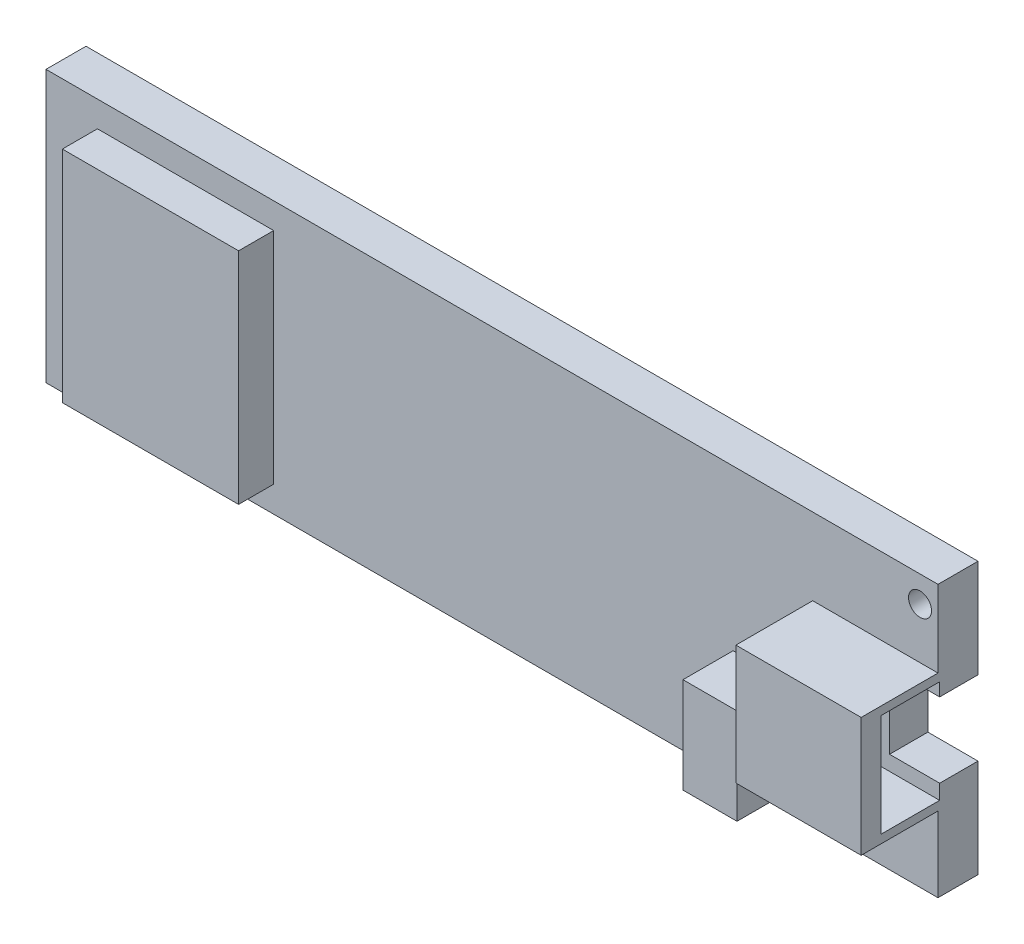
ISO-10303-21;
HEADER;
FILE_DESCRIPTION(('STEP AP214'),'2;1');
FILE_NAME('part.step','',(''),(''),'','','');
FILE_SCHEMA(('AUTOMOTIVE_DESIGN { 1 0 10303 214 1 1 1 1 }'));
ENDSEC;
DATA;
#1=APPLICATION_CONTEXT('core data for automotive mechanical design processes');
#2=APPLICATION_PROTOCOL_DEFINITION('international standard','automotive_design',2000,#1);
#3=PRODUCT_CONTEXT('',#1,'mechanical');
#4=PRODUCT('Part','Part','',(#3));
#5=PRODUCT_RELATED_PRODUCT_CATEGORY('part','',(#4));
#6=PRODUCT_DEFINITION_FORMATION('','',#4);
#7=PRODUCT_DEFINITION_CONTEXT('part definition',#1,'design');
#8=PRODUCT_DEFINITION('design','',#6,#7);
#9=PRODUCT_DEFINITION_SHAPE('','',#8);
#10=(LENGTH_UNIT() NAMED_UNIT(*) SI_UNIT(.MILLI.,.METRE.));
#11=(NAMED_UNIT(*) PLANE_ANGLE_UNIT() SI_UNIT($,.RADIAN.));
#12=(NAMED_UNIT(*) SI_UNIT($,.STERADIAN.) SOLID_ANGLE_UNIT());
#13=UNCERTAINTY_MEASURE_WITH_UNIT(LENGTH_MEASURE(1.E-05),#10,'distance_accuracy_value','');
#14=(GEOMETRIC_REPRESENTATION_CONTEXT(3) GLOBAL_UNCERTAINTY_ASSIGNED_CONTEXT((#13)) GLOBAL_UNIT_ASSIGNED_CONTEXT((#10,
#11,#12)) REPRESENTATION_CONTEXT('',''));
#15=CARTESIAN_POINT('',(0.,0.,0.));
#16=DIRECTION('',(0.,0.,1.));
#17=DIRECTION('',(1.,0.,0.));
#18=AXIS2_PLACEMENT_3D('',#15,#16,#17);
#19=CARTESIAN_POINT('',(-53.4,16.25,4.79));
#20=DIRECTION('',(0.,0.,1.));
#21=DIRECTION('',(1.,0.,0.));
#22=AXIS2_PLACEMENT_3D('',#19,#20,#21);
#23=PLANE('',#22);
#24=CARTESIAN_POINT('',(51.25,13.12,4.79));
#25=DIRECTION('',(0.,0.,1.));
#26=DIRECTION('',(1.,0.,0.));
#27=AXIS2_PLACEMENT_3D('',#24,#25,#26);
#28=CIRCLE('',#27,1.375);
#29=CARTESIAN_POINT('',(52.625,13.12,4.79));
#30=VERTEX_POINT('',#29);
#31=EDGE_CURVE('E252',#30,#30,#28,.T.);
#32=ORIENTED_EDGE('',*,*,#31,.F.);
#33=EDGE_LOOP('',(#32));
#34=FACE_BOUND('',#33,.T.);
#35=DIRECTION('',(0.,-1.,0.));
#36=VECTOR('',#35,1.);
#37=CARTESIAN_POINT('',(38.4,7.05,4.79));
#38=LINE('',#37,#36);
#39=CARTESIAN_POINT('',(38.4,7.05,4.79));
#40=VERTEX_POINT('',#39);
#41=CARTESIAN_POINT('',(38.4,-7.25,4.79));
#42=VERTEX_POINT('',#41);
#43=EDGE_CURVE('E307',#40,#42,#38,.T.);
#44=ORIENTED_EDGE('',*,*,#43,.F.);
#45=DIRECTION('',(-1.,0.,0.));
#46=VECTOR('',#45,1.);
#47=CARTESIAN_POINT('',(53.4,7.05,4.79));
#48=LINE('',#47,#46);
#49=CARTESIAN_POINT('',(53.4,7.05,4.79));
#50=VERTEX_POINT('',#49);
#51=EDGE_CURVE('E293',#50,#40,#48,.T.);
#52=ORIENTED_EDGE('',*,*,#51,.F.);
#53=DIRECTION('',(0.,1.,0.));
#54=VECTOR('',#53,1.);
#55=CARTESIAN_POINT('',(53.4,-16.25,4.79));
#56=LINE('',#55,#54);
#57=CARTESIAN_POINT('',(53.4,16.25,4.79));
#58=VERTEX_POINT('',#57);
#59=EDGE_CURVE('E359',#50,#58,#56,.T.);
#60=ORIENTED_EDGE('',*,*,#59,.T.);
#61=DIRECTION('',(-1.,0.,0.));
#62=VECTOR('',#61,1.);
#63=CARTESIAN_POINT('',(53.4,16.25,4.79));
#64=LINE('',#63,#62);
#65=CARTESIAN_POINT('',(-53.4,16.25,4.79));
#66=VERTEX_POINT('',#65);
#67=EDGE_CURVE('E362',#58,#66,#64,.T.);
#68=ORIENTED_EDGE('',*,*,#67,.T.);
#69=DIRECTION('',(0.,-1.,0.));
#70=VECTOR('',#69,1.);
#71=CARTESIAN_POINT('',(-53.4,-16.25,4.79));
#72=LINE('',#71,#70);
#73=CARTESIAN_POINT('',(-53.4,-16.25,4.79));
#74=VERTEX_POINT('',#73);
#75=EDGE_CURVE('E353',#66,#74,#72,.T.);
#76=ORIENTED_EDGE('',*,*,#75,.T.);
#77=DIRECTION('',(1.,0.,0.));
#78=VECTOR('',#77,1.);
#79=CARTESIAN_POINT('',(53.4,-16.25,4.79));
#80=LINE('',#79,#78);
#81=CARTESIAN_POINT('',(53.4,-16.25,4.79));
#82=VERTEX_POINT('',#81);
#83=EDGE_CURVE('E356',#74,#82,#80,.T.);
#84=ORIENTED_EDGE('',*,*,#83,.T.);
#85=CARTESIAN_POINT('',(53.4,-7.24999999999999,4.79));
#86=VERTEX_POINT('',#85);
#87=EDGE_CURVE('E360',#82,#86,#56,.T.);
#88=ORIENTED_EDGE('',*,*,#87,.T.);
#89=DIRECTION('',(1.,0.,0.));
#90=VECTOR('',#89,1.);
#91=CARTESIAN_POINT('',(53.4,-7.24999999999999,4.79));
#92=LINE('',#91,#90);
#93=EDGE_CURVE('E298',#42,#86,#92,.T.);
#94=ORIENTED_EDGE('',*,*,#93,.F.);
#95=EDGE_LOOP('',(#44,#52,#60,#68,#76,#84,#88,#94));
#96=FACE_BOUND('',#95,.T.);
#97=DIRECTION('',(1.,0.,0.));
#98=VECTOR('',#97,1.);
#99=CARTESIAN_POINT('',(-47.24,-13.1357203082705,4.79));
#100=LINE('',#99,#98);
#101=CARTESIAN_POINT('',(-47.24,-13.1357203082705,4.79));
#102=VERTEX_POINT('',#101);
#103=CARTESIAN_POINT('',(-26.14,-13.1357203082705,4.79));
#104=VERTEX_POINT('',#103);
#105=EDGE_CURVE('E337',#102,#104,#100,.T.);
#106=ORIENTED_EDGE('',*,*,#105,.F.);
#107=DIRECTION('',(0.,-1.,0.));
#108=VECTOR('',#107,1.);
#109=CARTESIAN_POINT('',(-47.24,13.1642796917295,4.79));
#110=LINE('',#109,#108);
#111=CARTESIAN_POINT('',(-47.24,13.1642796917295,4.79));
#112=VERTEX_POINT('',#111);
#113=EDGE_CURVE('E323',#112,#102,#110,.T.);
#114=ORIENTED_EDGE('',*,*,#113,.F.);
#115=DIRECTION('',(-1.,0.,0.));
#116=VECTOR('',#115,1.);
#117=CARTESIAN_POINT('',(-47.24,13.1642796917295,4.79));
#118=LINE('',#117,#116);
#119=CARTESIAN_POINT('',(-26.14,13.1642796917295,4.79));
#120=VERTEX_POINT('',#119);
#121=EDGE_CURVE('E328',#120,#112,#118,.T.);
#122=ORIENTED_EDGE('',*,*,#121,.F.);
#123=DIRECTION('',(0.,1.,0.));
#124=VECTOR('',#123,1.);
#125=CARTESIAN_POINT('',(-26.14,13.1642796917295,4.79));
#126=LINE('',#125,#124);
#127=EDGE_CURVE('E339',#104,#120,#126,.T.);
#128=ORIENTED_EDGE('',*,*,#127,.F.);
#129=EDGE_LOOP('',(#106,#114,#122,#128));
#130=FACE_BOUND('',#129,.T.);
#131=DIRECTION('',(-1.,0.,0.));
#132=VECTOR('',#131,1.);
#133=CARTESIAN_POINT('',(28.865,-2.905,4.79));
#134=LINE('',#133,#132);
#135=CARTESIAN_POINT('',(35.335,-2.905,4.79));
#136=VERTEX_POINT('',#135);
#137=CARTESIAN_POINT('',(28.865,-2.905,4.79));
#138=VERTEX_POINT('',#137);
#139=EDGE_CURVE('E278',#136,#138,#134,.T.);
#140=ORIENTED_EDGE('',*,*,#139,.F.);
#141=DIRECTION('',(0.,1.,0.));
#142=VECTOR('',#141,1.);
#143=CARTESIAN_POINT('',(35.335,-2.905,4.79));
#144=LINE('',#143,#142);
#145=CARTESIAN_POINT('',(35.335,-14.355,4.79));
#146=VERTEX_POINT('',#145);
#147=EDGE_CURVE('E262',#146,#136,#144,.T.);
#148=ORIENTED_EDGE('',*,*,#147,.F.);
#149=DIRECTION('',(1.,0.,0.));
#150=VECTOR('',#149,1.);
#151=CARTESIAN_POINT('',(28.865,-14.355,4.79));
#152=LINE('',#151,#150);
#153=CARTESIAN_POINT('',(28.865,-14.355,4.79));
#154=VERTEX_POINT('',#153);
#155=EDGE_CURVE('E269',#154,#146,#152,.T.);
#156=ORIENTED_EDGE('',*,*,#155,.F.);
#157=DIRECTION('',(0.,-1.,0.));
#158=VECTOR('',#157,1.);
#159=CARTESIAN_POINT('',(28.865,-2.905,4.79));
#160=LINE('',#159,#158);
#161=EDGE_CURVE('E280',#138,#154,#160,.T.);
#162=ORIENTED_EDGE('',*,*,#161,.F.);
#163=EDGE_LOOP('',(#140,#148,#156,#162));
#164=FACE_BOUND('',#163,.T.);
#165=ADVANCED_FACE('F34',(#34,#96,#130,#164),#23,.T.);
#166=CARTESIAN_POINT('',(-53.4,-16.25,4.79));
#167=DIRECTION('',(1.,0.,0.));
#168=DIRECTION('',(0.,0.,-1.));
#169=AXIS2_PLACEMENT_3D('',#166,#167,#168);
#170=PLANE('',#169);
#171=DIRECTION('',(0.,-1.,0.));
#172=VECTOR('',#171,1.);
#173=CARTESIAN_POINT('',(-53.4,-16.25,0.));
#174=LINE('',#173,#172);
#175=CARTESIAN_POINT('',(-53.4,16.25,0.));
#176=VERTEX_POINT('',#175);
#177=CARTESIAN_POINT('',(-53.4,-16.25,0.));
#178=VERTEX_POINT('',#177);
#179=EDGE_CURVE('E352',#176,#178,#174,.T.);
#180=ORIENTED_EDGE('',*,*,#179,.T.);
#181=DIRECTION('',(0.,0.,-1.));
#182=VECTOR('',#181,1.);
#183=CARTESIAN_POINT('',(-53.4,-16.25,4.79));
#184=LINE('',#183,#182);
#185=EDGE_CURVE('E11',#74,#178,#184,.T.);
#186=ORIENTED_EDGE('',*,*,#185,.F.);
#187=ORIENTED_EDGE('',*,*,#75,.F.);
#188=DIRECTION('',(0.,0.,-1.));
#189=VECTOR('',#188,1.);
#190=CARTESIAN_POINT('',(-53.4,16.25,4.79));
#191=LINE('',#190,#189);
#192=EDGE_CURVE('E364',#66,#176,#191,.T.);
#193=ORIENTED_EDGE('',*,*,#192,.T.);
#194=EDGE_LOOP('',(#180,#186,#187,#193));
#195=FACE_BOUND('',#194,.T.);
#196=ADVANCED_FACE('F36',(#195),#170,.F.);
#197=CARTESIAN_POINT('',(53.4,-16.25,4.79));
#198=DIRECTION('',(0.,1.,0.));
#199=DIRECTION('',(-1.,0.,0.));
#200=AXIS2_PLACEMENT_3D('',#197,#198,#199);
#201=PLANE('',#200);
#202=DIRECTION('',(1.,0.,0.));
#203=VECTOR('',#202,1.);
#204=CARTESIAN_POINT('',(53.4,-16.25,0.));
#205=LINE('',#204,#203);
#206=CARTESIAN_POINT('',(53.4,-16.25,0.));
#207=VERTEX_POINT('',#206);
#208=EDGE_CURVE('E367',#178,#207,#205,.T.);
#209=ORIENTED_EDGE('',*,*,#208,.T.);
#210=DIRECTION('',(0.,0.,-1.));
#211=VECTOR('',#210,1.);
#212=CARTESIAN_POINT('',(53.4,-16.25,4.79));
#213=LINE('',#212,#211);
#214=EDGE_CURVE('E42',#82,#207,#213,.T.);
#215=ORIENTED_EDGE('',*,*,#214,.F.);
#216=ORIENTED_EDGE('',*,*,#83,.F.);
#217=ORIENTED_EDGE('',*,*,#185,.T.);
#218=EDGE_LOOP('',(#209,#215,#216,#217));
#219=FACE_BOUND('',#218,.T.);
#220=ADVANCED_FACE('F437',(#219),#201,.F.);
#221=CARTESIAN_POINT('',(53.4,-16.25,4.79));
#222=DIRECTION('',(-1.,0.,0.));
#223=DIRECTION('',(0.,0.,1.));
#224=AXIS2_PLACEMENT_3D('',#221,#222,#223);
#225=PLANE('',#224);
#226=DIRECTION('',(0.,1.,0.));
#227=VECTOR('',#226,1.);
#228=CARTESIAN_POINT('',(53.4,6.05,4.59));
#229=LINE('',#228,#227);
#230=CARTESIAN_POINT('',(53.4,4.47160775924506,4.59));
#231=VERTEX_POINT('',#230);
#232=CARTESIAN_POINT('',(53.4,6.05,4.59));
#233=VERTEX_POINT('',#232);
#234=EDGE_CURVE('E243',#231,#233,#229,.T.);
#235=ORIENTED_EDGE('',*,*,#234,.F.);
#236=DIRECTION('',(0.,0.,1.));
#237=VECTOR('',#236,1.);
#238=CARTESIAN_POINT('',(53.4,4.47160775924506,-0.327083014133882));
#239=LINE('',#238,#237);
#240=CARTESIAN_POINT('',(53.4,4.47160775924506,0.));
#241=VERTEX_POINT('',#240);
#242=EDGE_CURVE('E211',#241,#231,#239,.T.);
#243=ORIENTED_EDGE('',*,*,#242,.F.);
#244=DIRECTION('',(0.,1.,0.));
#245=VECTOR('',#244,1.);
#246=CARTESIAN_POINT('',(53.4,-16.25,0.));
#247=LINE('',#246,#245);
#248=CARTESIAN_POINT('',(53.4,16.25,0.));
#249=VERTEX_POINT('',#248);
#250=EDGE_CURVE('E369',#241,#249,#247,.T.);
#251=ORIENTED_EDGE('',*,*,#250,.T.);
#252=DIRECTION('',(0.,0.,-1.));
#253=VECTOR('',#252,1.);
#254=CARTESIAN_POINT('',(53.4,16.25,4.79));
#255=LINE('',#254,#253);
#256=EDGE_CURVE('E376',#58,#249,#255,.T.);
#257=ORIENTED_EDGE('',*,*,#256,.F.);
#258=ORIENTED_EDGE('',*,*,#59,.F.);
#259=DIRECTION('',(0.,0.,-1.));
#260=VECTOR('',#259,1.);
#261=CARTESIAN_POINT('',(53.4,7.05,13.99));
#262=LINE('',#261,#260);
#263=CARTESIAN_POINT('',(53.4,7.05,13.99));
#264=VERTEX_POINT('',#263);
#265=EDGE_CURVE('E320',#264,#50,#262,.T.);
#266=ORIENTED_EDGE('',*,*,#265,.F.);
#267=DIRECTION('',(0.,1.,0.));
#268=VECTOR('',#267,1.);
#269=CARTESIAN_POINT('',(53.4,7.05,13.99));
#270=LINE('',#269,#268);
#271=CARTESIAN_POINT('',(53.4,-7.24999999999999,13.99));
#272=VERTEX_POINT('',#271);
#273=EDGE_CURVE('E294',#272,#264,#270,.T.);
#274=ORIENTED_EDGE('',*,*,#273,.F.);
#275=DIRECTION('',(0.,0.,-1.));
#276=VECTOR('',#275,1.);
#277=CARTESIAN_POINT('',(53.4,-7.24999999999999,13.99));
#278=LINE('',#277,#276);
#279=EDGE_CURVE('E304',#272,#86,#278,.T.);
#280=ORIENTED_EDGE('',*,*,#279,.T.);
#281=ORIENTED_EDGE('',*,*,#87,.F.);
#282=ORIENTED_EDGE('',*,*,#214,.T.);
#283=CARTESIAN_POINT('',(53.4,-4.47160775924506,0.));
#284=VERTEX_POINT('',#283);
#285=EDGE_CURVE('E370',#207,#284,#247,.T.);
#286=ORIENTED_EDGE('',*,*,#285,.T.);
#287=DIRECTION('',(0.,0.,-1.));
#288=VECTOR('',#287,1.);
#289=CARTESIAN_POINT('',(53.4,-4.47160775924506,-0.327083014133882));
#290=LINE('',#289,#288);
#291=CARTESIAN_POINT('',(53.4,-4.47160775924506,4.59));
#292=VERTEX_POINT('',#291);
#293=EDGE_CURVE('E395',#292,#284,#290,.T.);
#294=ORIENTED_EDGE('',*,*,#293,.F.);
#295=CARTESIAN_POINT('',(53.4,-6.24999999999999,4.59));
#296=VERTEX_POINT('',#295);
#297=EDGE_CURVE('E216',#296,#292,#229,.T.);
#298=ORIENTED_EDGE('',*,*,#297,.F.);
#299=DIRECTION('',(0.,0.,-1.));
#300=VECTOR('',#299,1.);
#301=CARTESIAN_POINT('',(53.4,-6.24999999999999,11.59));
#302=LINE('',#301,#300);
#303=CARTESIAN_POINT('',(53.4,-6.24999999999999,11.59));
#304=VERTEX_POINT('',#303);
#305=EDGE_CURVE('E57',#304,#296,#302,.T.);
#306=ORIENTED_EDGE('',*,*,#305,.F.);
#307=DIRECTION('',(0.,-1.,0.));
#308=VECTOR('',#307,1.);
#309=CARTESIAN_POINT('',(53.4,6.05,11.59));
#310=LINE('',#309,#308);
#311=CARTESIAN_POINT('',(53.4,6.05,11.59));
#312=VERTEX_POINT('',#311);
#313=EDGE_CURVE('E232',#312,#304,#310,.T.);
#314=ORIENTED_EDGE('',*,*,#313,.F.);
#315=DIRECTION('',(0.,0.,1.));
#316=VECTOR('',#315,1.);
#317=CARTESIAN_POINT('',(53.4,6.05,11.59));
#318=LINE('',#317,#316);
#319=EDGE_CURVE('E245',#233,#312,#318,.T.);
#320=ORIENTED_EDGE('',*,*,#319,.F.);
#321=EDGE_LOOP('',(#235,#243,#251,#257,#258,#266,#274,#280,#281,#282,#286,#294,#298,#306,#314,#320));
#322=FACE_BOUND('',#321,.T.);
#323=ADVANCED_FACE('F384',(#322),#225,.F.);
#324=CARTESIAN_POINT('',(53.4,16.25,4.79));
#325=DIRECTION('',(0.,-1.,0.));
#326=DIRECTION('',(1.,0.,0.));
#327=AXIS2_PLACEMENT_3D('',#324,#325,#326);
#328=PLANE('',#327);
#329=DIRECTION('',(-1.,0.,0.));
#330=VECTOR('',#329,1.);
#331=CARTESIAN_POINT('',(53.4,16.25,0.));
#332=LINE('',#331,#330);
#333=EDGE_CURVE('E357',#249,#176,#332,.T.);
#334=ORIENTED_EDGE('',*,*,#333,.T.);
#335=ORIENTED_EDGE('',*,*,#192,.F.);
#336=ORIENTED_EDGE('',*,*,#67,.F.);
#337=ORIENTED_EDGE('',*,*,#256,.T.);
#338=EDGE_LOOP('',(#334,#335,#336,#337));
#339=FACE_BOUND('',#338,.T.);
#340=ADVANCED_FACE('F399',(#339),#328,.F.);
#341=CARTESIAN_POINT('',(-53.4,16.25,0.));
#342=DIRECTION('',(0.,0.,1.));
#343=DIRECTION('',(1.,0.,0.));
#344=AXIS2_PLACEMENT_3D('',#341,#342,#343);
#345=PLANE('',#344);
#346=ORIENTED_EDGE('',*,*,#250,.F.);
#347=DIRECTION('',(-1.,0.,0.));
#348=VECTOR('',#347,1.);
#349=CARTESIAN_POINT('',(-53.4,4.47160775924506,0.));
#350=LINE('',#349,#348);
#351=CARTESIAN_POINT('',(47.4,4.47160775924506,0.));
#352=VERTEX_POINT('',#351);
#353=EDGE_CURVE('E225',#241,#352,#350,.T.);
#354=ORIENTED_EDGE('',*,*,#353,.T.);
#355=DIRECTION('',(0.,1.,0.));
#356=VECTOR('',#355,1.);
#357=CARTESIAN_POINT('',(47.4,16.25,0.));
#358=LINE('',#357,#356);
#359=CARTESIAN_POINT('',(47.4,-4.47160775924506,0.));
#360=VERTEX_POINT('',#359);
#361=EDGE_CURVE('E218',#360,#352,#358,.T.);
#362=ORIENTED_EDGE('',*,*,#361,.F.);
#363=DIRECTION('',(1.,0.,0.));
#364=VECTOR('',#363,1.);
#365=CARTESIAN_POINT('',(-53.4,-4.47160775924506,0.));
#366=LINE('',#365,#364);
#367=EDGE_CURVE('E202',#360,#284,#366,.T.);
#368=ORIENTED_EDGE('',*,*,#367,.T.);
#369=ORIENTED_EDGE('',*,*,#285,.F.);
#370=ORIENTED_EDGE('',*,*,#208,.F.);
#371=ORIENTED_EDGE('',*,*,#179,.F.);
#372=ORIENTED_EDGE('',*,*,#333,.F.);
#373=EDGE_LOOP('',(#346,#354,#362,#368,#369,#370,#371,#372));
#374=FACE_BOUND('',#373,.T.);
#375=CARTESIAN_POINT('',(51.25,13.12,0.));
#376=DIRECTION('',(0.,0.,1.));
#377=DIRECTION('',(1.,0.,0.));
#378=AXIS2_PLACEMENT_3D('',#375,#376,#377);
#379=CIRCLE('',#378,1.375);
#380=CARTESIAN_POINT('',(52.625,13.12,0.));
#381=VERTEX_POINT('',#380);
#382=EDGE_CURVE('E259',#381,#381,#379,.T.);
#383=ORIENTED_EDGE('',*,*,#382,.T.);
#384=EDGE_LOOP('',(#383));
#385=FACE_BOUND('',#384,.T.);
#386=ADVANCED_FACE('F388',(#374,#385),#345,.F.);
#387=CARTESIAN_POINT('',(-47.24,13.1642796917295,8.99));
#388=DIRECTION('',(1.,0.,0.));
#389=DIRECTION('',(0.,0.,-1.));
#390=AXIS2_PLACEMENT_3D('',#387,#388,#389);
#391=PLANE('',#390);
#392=ORIENTED_EDGE('',*,*,#113,.T.);
#393=DIRECTION('',(0.,0.,-1.));
#394=VECTOR('',#393,1.);
#395=CARTESIAN_POINT('',(-47.24,-13.1357203082705,8.99));
#396=LINE('',#395,#394);
#397=CARTESIAN_POINT('',(-47.24,-13.1357203082705,8.99));
#398=VERTEX_POINT('',#397);
#399=EDGE_CURVE('E350',#398,#102,#396,.T.);
#400=ORIENTED_EDGE('',*,*,#399,.F.);
#401=DIRECTION('',(0.,-1.,0.));
#402=VECTOR('',#401,1.);
#403=CARTESIAN_POINT('',(-47.24,13.1642796917295,8.99));
#404=LINE('',#403,#402);
#405=CARTESIAN_POINT('',(-47.24,13.1642796917295,8.99));
#406=VERTEX_POINT('',#405);
#407=EDGE_CURVE('E324',#406,#398,#404,.T.);
#408=ORIENTED_EDGE('',*,*,#407,.F.);
#409=DIRECTION('',(0.,0.,-1.));
#410=VECTOR('',#409,1.);
#411=CARTESIAN_POINT('',(-47.24,13.1642796917295,8.99));
#412=LINE('',#411,#410);
#413=EDGE_CURVE('E334',#406,#112,#412,.T.);
#414=ORIENTED_EDGE('',*,*,#413,.T.);
#415=EDGE_LOOP('',(#392,#400,#408,#414));
#416=FACE_BOUND('',#415,.T.);
#417=ADVANCED_FACE('F441',(#416),#391,.F.);
#418=CARTESIAN_POINT('',(-47.24,-13.1357203082705,8.99));
#419=DIRECTION('',(0.,1.,0.));
#420=DIRECTION('',(0.,0.,1.));
#421=AXIS2_PLACEMENT_3D('',#418,#419,#420);
#422=PLANE('',#421);
#423=ORIENTED_EDGE('',*,*,#105,.T.);
#424=DIRECTION('',(0.,0.,-1.));
#425=VECTOR('',#424,1.);
#426=CARTESIAN_POINT('',(-26.14,-13.1357203082705,8.99));
#427=LINE('',#426,#425);
#428=CARTESIAN_POINT('',(-26.14,-13.1357203082705,8.99));
#429=VERTEX_POINT('',#428);
#430=EDGE_CURVE('E347',#429,#104,#427,.T.);
#431=ORIENTED_EDGE('',*,*,#430,.F.);
#432=DIRECTION('',(1.,0.,0.));
#433=VECTOR('',#432,1.);
#434=CARTESIAN_POINT('',(-47.24,-13.1357203082705,8.99));
#435=LINE('',#434,#433);
#436=EDGE_CURVE('E327',#398,#429,#435,.T.);
#437=ORIENTED_EDGE('',*,*,#436,.F.);
#438=ORIENTED_EDGE('',*,*,#399,.T.);
#439=EDGE_LOOP('',(#423,#431,#437,#438));
#440=FACE_BOUND('',#439,.T.);
#441=ADVANCED_FACE('F473',(#440),#422,.F.);
#442=CARTESIAN_POINT('',(-26.14,13.1642796917295,8.99));
#443=DIRECTION('',(-1.,0.,0.));
#444=DIRECTION('',(0.,-1.,0.));
#445=AXIS2_PLACEMENT_3D('',#442,#443,#444);
#446=PLANE('',#445);
#447=ORIENTED_EDGE('',*,*,#127,.T.);
#448=DIRECTION('',(0.,0.,-1.));
#449=VECTOR('',#448,1.);
#450=CARTESIAN_POINT('',(-26.14,13.1642796917295,8.99));
#451=LINE('',#450,#449);
#452=CARTESIAN_POINT('',(-26.14,13.1642796917295,8.99));
#453=VERTEX_POINT('',#452);
#454=EDGE_CURVE('E345',#453,#120,#451,.T.);
#455=ORIENTED_EDGE('',*,*,#454,.F.);
#456=DIRECTION('',(0.,1.,0.));
#457=VECTOR('',#456,1.);
#458=CARTESIAN_POINT('',(-26.14,13.1642796917295,8.99));
#459=LINE('',#458,#457);
#460=EDGE_CURVE('E330',#429,#453,#459,.T.);
#461=ORIENTED_EDGE('',*,*,#460,.F.);
#462=ORIENTED_EDGE('',*,*,#430,.T.);
#463=EDGE_LOOP('',(#447,#455,#461,#462));
#464=FACE_BOUND('',#463,.T.);
#465=ADVANCED_FACE('F480',(#464),#446,.F.);
#466=CARTESIAN_POINT('',(-47.24,13.1642796917295,8.99));
#467=DIRECTION('',(0.,-1.,0.));
#468=DIRECTION('',(0.,0.,-1.));
#469=AXIS2_PLACEMENT_3D('',#466,#467,#468);
#470=PLANE('',#469);
#471=ORIENTED_EDGE('',*,*,#121,.T.);
#472=ORIENTED_EDGE('',*,*,#413,.F.);
#473=DIRECTION('',(-1.,0.,0.));
#474=VECTOR('',#473,1.);
#475=CARTESIAN_POINT('',(-47.24,13.1642796917295,8.99));
#476=LINE('',#475,#474);
#477=EDGE_CURVE('E332',#453,#406,#476,.T.);
#478=ORIENTED_EDGE('',*,*,#477,.F.);
#479=ORIENTED_EDGE('',*,*,#454,.T.);
#480=EDGE_LOOP('',(#471,#472,#478,#479));
#481=FACE_BOUND('',#480,.T.);
#482=ADVANCED_FACE('F487',(#481),#470,.F.);
#483=CARTESIAN_POINT('',(-47.24,-13.1357203082705,8.99));
#484=DIRECTION('',(0.,0.,1.));
#485=DIRECTION('',(1.,0.,0.));
#486=AXIS2_PLACEMENT_3D('',#483,#484,#485);
#487=PLANE('',#486);
#488=ORIENTED_EDGE('',*,*,#407,.T.);
#489=ORIENTED_EDGE('',*,*,#436,.T.);
#490=ORIENTED_EDGE('',*,*,#460,.T.);
#491=ORIENTED_EDGE('',*,*,#477,.T.);
#492=EDGE_LOOP('',(#488,#489,#490,#491));
#493=FACE_BOUND('',#492,.T.);
#494=ADVANCED_FACE('F429',(#493),#487,.T.);
#495=CARTESIAN_POINT('',(53.4,7.05,13.99));
#496=DIRECTION('',(0.,-1.,0.));
#497=DIRECTION('',(1.,0.,0.));
#498=AXIS2_PLACEMENT_3D('',#495,#496,#497);
#499=PLANE('',#498);
#500=ORIENTED_EDGE('',*,*,#51,.T.);
#501=DIRECTION('',(0.,0.,-1.));
#502=VECTOR('',#501,1.);
#503=CARTESIAN_POINT('',(38.4,7.05,13.99));
#504=LINE('',#503,#502);
#505=CARTESIAN_POINT('',(38.4,7.05,13.99));
#506=VERTEX_POINT('',#505);
#507=EDGE_CURVE('E317',#506,#40,#504,.T.);
#508=ORIENTED_EDGE('',*,*,#507,.F.);
#509=DIRECTION('',(-1.,0.,0.));
#510=VECTOR('',#509,1.);
#511=CARTESIAN_POINT('',(53.4,7.05,13.99));
#512=LINE('',#511,#510);
#513=EDGE_CURVE('E297',#264,#506,#512,.T.);
#514=ORIENTED_EDGE('',*,*,#513,.F.);
#515=ORIENTED_EDGE('',*,*,#265,.T.);
#516=EDGE_LOOP('',(#500,#508,#514,#515));
#517=FACE_BOUND('',#516,.T.);
#518=ADVANCED_FACE('F410',(#517),#499,.F.);
#519=CARTESIAN_POINT('',(38.4,7.05,13.99));
#520=DIRECTION('',(1.,0.,0.));
#521=DIRECTION('',(0.,0.,-1.));
#522=AXIS2_PLACEMENT_3D('',#519,#520,#521);
#523=PLANE('',#522);
#524=ORIENTED_EDGE('',*,*,#43,.T.);
#525=DIRECTION('',(0.,0.,-1.));
#526=VECTOR('',#525,1.);
#527=CARTESIAN_POINT('',(38.4,-7.24999999999999,13.99));
#528=LINE('',#527,#526);
#529=CARTESIAN_POINT('',(38.4,-7.24999999999999,13.99));
#530=VERTEX_POINT('',#529);
#531=EDGE_CURVE('E314',#530,#42,#528,.T.);
#532=ORIENTED_EDGE('',*,*,#531,.F.);
#533=DIRECTION('',(0.,-1.,0.));
#534=VECTOR('',#533,1.);
#535=CARTESIAN_POINT('',(38.4,7.05,13.99));
#536=LINE('',#535,#534);
#537=EDGE_CURVE('E300',#506,#530,#536,.T.);
#538=ORIENTED_EDGE('',*,*,#537,.F.);
#539=ORIENTED_EDGE('',*,*,#507,.T.);
#540=EDGE_LOOP('',(#524,#532,#538,#539));
#541=FACE_BOUND('',#540,.T.);
#542=ADVANCED_FACE('F421',(#541),#523,.F.);
#543=CARTESIAN_POINT('',(53.4,-7.24999999999999,13.99));
#544=DIRECTION('',(0.,1.,0.));
#545=DIRECTION('',(-1.,0.,0.));
#546=AXIS2_PLACEMENT_3D('',#543,#544,#545);
#547=PLANE('',#546);
#548=ORIENTED_EDGE('',*,*,#93,.T.);
#549=ORIENTED_EDGE('',*,*,#279,.F.);
#550=DIRECTION('',(1.,0.,0.));
#551=VECTOR('',#550,1.);
#552=CARTESIAN_POINT('',(53.4,-7.24999999999999,13.99));
#553=LINE('',#552,#551);
#554=EDGE_CURVE('E302',#530,#272,#553,.T.);
#555=ORIENTED_EDGE('',*,*,#554,.F.);
#556=ORIENTED_EDGE('',*,*,#531,.T.);
#557=EDGE_LOOP('',(#548,#549,#555,#556));
#558=FACE_BOUND('',#557,.T.);
#559=ADVANCED_FACE('F419',(#558),#547,.F.);
#560=CARTESIAN_POINT('',(53.4,-7.24999999999999,13.99));
#561=DIRECTION('',(0.,0.,-1.));
#562=DIRECTION('',(-1.,0.,0.));
#563=AXIS2_PLACEMENT_3D('',#560,#561,#562);
#564=PLANE('',#563);
#565=ORIENTED_EDGE('',*,*,#273,.T.);
#566=ORIENTED_EDGE('',*,*,#513,.T.);
#567=ORIENTED_EDGE('',*,*,#537,.T.);
#568=ORIENTED_EDGE('',*,*,#554,.T.);
#569=EDGE_LOOP('',(#565,#566,#567,#568));
#570=FACE_BOUND('',#569,.T.);
#571=ADVANCED_FACE('F414',(#570),#564,.F.);
#572=CARTESIAN_POINT('',(35.335,-2.905,10.79));
#573=DIRECTION('',(-1.,0.,0.));
#574=DIRECTION('',(0.,0.,1.));
#575=AXIS2_PLACEMENT_3D('',#572,#573,#574);
#576=PLANE('',#575);
#577=ORIENTED_EDGE('',*,*,#147,.T.);
#578=DIRECTION('',(0.,0.,-1.));
#579=VECTOR('',#578,1.);
#580=CARTESIAN_POINT('',(35.335,-2.905,10.79));
#581=LINE('',#580,#579);
#582=CARTESIAN_POINT('',(35.335,-2.905,10.79));
#583=VERTEX_POINT('',#582);
#584=EDGE_CURVE('E291',#583,#136,#581,.T.);
#585=ORIENTED_EDGE('',*,*,#584,.F.);
#586=DIRECTION('',(0.,1.,0.));
#587=VECTOR('',#586,1.);
#588=CARTESIAN_POINT('',(35.335,-2.905,10.79));
#589=LINE('',#588,#587);
#590=CARTESIAN_POINT('',(35.335,-14.355,10.79));
#591=VERTEX_POINT('',#590);
#592=EDGE_CURVE('E265',#591,#583,#589,.T.);
#593=ORIENTED_EDGE('',*,*,#592,.F.);
#594=DIRECTION('',(0.,0.,-1.));
#595=VECTOR('',#594,1.);
#596=CARTESIAN_POINT('',(35.335,-14.355,10.79));
#597=LINE('',#596,#595);
#598=EDGE_CURVE('E275',#591,#146,#597,.T.);
#599=ORIENTED_EDGE('',*,*,#598,.T.);
#600=EDGE_LOOP('',(#577,#585,#593,#599));
#601=FACE_BOUND('',#600,.T.);
#602=ADVANCED_FACE('F526',(#601),#576,.F.);
#603=CARTESIAN_POINT('',(28.865,-2.905,10.79));
#604=DIRECTION('',(0.,-1.,0.));
#605=DIRECTION('',(0.,0.,-1.));
#606=AXIS2_PLACEMENT_3D('',#603,#604,#605);
#607=PLANE('',#606);
#608=ORIENTED_EDGE('',*,*,#139,.T.);
#609=DIRECTION('',(0.,0.,-1.));
#610=VECTOR('',#609,1.);
#611=CARTESIAN_POINT('',(28.865,-2.905,10.79));
#612=LINE('',#611,#610);
#613=CARTESIAN_POINT('',(28.865,-2.905,10.79));
#614=VERTEX_POINT('',#613);
#615=EDGE_CURVE('E288',#614,#138,#612,.T.);
#616=ORIENTED_EDGE('',*,*,#615,.F.);
#617=DIRECTION('',(-1.,0.,0.));
#618=VECTOR('',#617,1.);
#619=CARTESIAN_POINT('',(28.865,-2.905,10.79));
#620=LINE('',#619,#618);
#621=EDGE_CURVE('E268',#583,#614,#620,.T.);
#622=ORIENTED_EDGE('',*,*,#621,.F.);
#623=ORIENTED_EDGE('',*,*,#584,.T.);
#624=EDGE_LOOP('',(#608,#616,#622,#623));
#625=FACE_BOUND('',#624,.T.);
#626=ADVANCED_FACE('F536',(#625),#607,.F.);
#627=CARTESIAN_POINT('',(28.865,-2.905,10.79));
#628=DIRECTION('',(1.,0.,0.));
#629=DIRECTION('',(0.,0.,-1.));
#630=AXIS2_PLACEMENT_3D('',#627,#628,#629);
#631=PLANE('',#630);
#632=ORIENTED_EDGE('',*,*,#161,.T.);
#633=DIRECTION('',(0.,0.,-1.));
#634=VECTOR('',#633,1.);
#635=CARTESIAN_POINT('',(28.865,-14.355,10.79));
#636=LINE('',#635,#634);
#637=CARTESIAN_POINT('',(28.865,-14.355,10.79));
#638=VERTEX_POINT('',#637);
#639=EDGE_CURVE('E286',#638,#154,#636,.T.);
#640=ORIENTED_EDGE('',*,*,#639,.F.);
#641=DIRECTION('',(0.,-1.,0.));
#642=VECTOR('',#641,1.);
#643=CARTESIAN_POINT('',(28.865,-2.905,10.79));
#644=LINE('',#643,#642);
#645=EDGE_CURVE('E271',#614,#638,#644,.T.);
#646=ORIENTED_EDGE('',*,*,#645,.F.);
#647=ORIENTED_EDGE('',*,*,#615,.T.);
#648=EDGE_LOOP('',(#632,#640,#646,#647));
#649=FACE_BOUND('',#648,.T.);
#650=ADVANCED_FACE('F546',(#649),#631,.F.);
#651=CARTESIAN_POINT('',(28.865,-14.355,10.79));
#652=DIRECTION('',(0.,1.,0.));
#653=DIRECTION('',(0.,0.,1.));
#654=AXIS2_PLACEMENT_3D('',#651,#652,#653);
#655=PLANE('',#654);
#656=ORIENTED_EDGE('',*,*,#155,.T.);
#657=ORIENTED_EDGE('',*,*,#598,.F.);
#658=DIRECTION('',(1.,0.,0.));
#659=VECTOR('',#658,1.);
#660=CARTESIAN_POINT('',(28.865,-14.355,10.79));
#661=LINE('',#660,#659);
#662=EDGE_CURVE('E273',#638,#591,#661,.T.);
#663=ORIENTED_EDGE('',*,*,#662,.F.);
#664=ORIENTED_EDGE('',*,*,#639,.T.);
#665=EDGE_LOOP('',(#656,#657,#663,#664));
#666=FACE_BOUND('',#665,.T.);
#667=ADVANCED_FACE('F556',(#666),#655,.F.);
#668=CARTESIAN_POINT('',(35.335,-14.355,10.79));
#669=DIRECTION('',(0.,0.,1.));
#670=DIRECTION('',(1.,0.,0.));
#671=AXIS2_PLACEMENT_3D('',#668,#669,#670);
#672=PLANE('',#671);
#673=ORIENTED_EDGE('',*,*,#592,.T.);
#674=ORIENTED_EDGE('',*,*,#621,.T.);
#675=ORIENTED_EDGE('',*,*,#645,.T.);
#676=ORIENTED_EDGE('',*,*,#662,.T.);
#677=EDGE_LOOP('',(#673,#674,#675,#676));
#678=FACE_BOUND('',#677,.T.);
#679=ADVANCED_FACE('F566',(#678),#672,.T.);
#680=CARTESIAN_POINT('',(51.25,13.12,0.));
#681=DIRECTION('',(0.,0.,1.));
#682=DIRECTION('',(1.,0.,0.));
#683=AXIS2_PLACEMENT_3D('',#680,#681,#682);
#684=CYLINDRICAL_SURFACE('',#683,1.375);
#685=ORIENTED_EDGE('',*,*,#382,.F.);
#686=EDGE_LOOP('',(#685));
#687=FACE_BOUND('',#686,.T.);
#688=ORIENTED_EDGE('',*,*,#31,.T.);
#689=EDGE_LOOP('',(#688));
#690=FACE_BOUND('',#689,.T.);
#691=ADVANCED_FACE('F576',(#687,#690),#684,.F.);
#692=CARTESIAN_POINT('',(41.4,-6.24999999999999,11.59));
#693=DIRECTION('',(0.,-1.,0.));
#694=DIRECTION('',(0.,0.,-1.));
#695=AXIS2_PLACEMENT_3D('',#692,#693,#694);
#696=PLANE('',#695);
#697=ORIENTED_EDGE('',*,*,#305,.T.);
#698=DIRECTION('',(1.,0.,0.));
#699=VECTOR('',#698,1.);
#700=CARTESIAN_POINT('',(41.4,-6.24999999999999,4.59));
#701=LINE('',#700,#699);
#702=CARTESIAN_POINT('',(41.4,-6.24999999999999,4.59));
#703=VERTEX_POINT('',#702);
#704=EDGE_CURVE('E241',#703,#296,#701,.T.);
#705=ORIENTED_EDGE('',*,*,#704,.F.);
#706=DIRECTION('',(0.,0.,-1.));
#707=VECTOR('',#706,1.);
#708=CARTESIAN_POINT('',(41.4,-6.24999999999999,11.59));
#709=LINE('',#708,#707);
#710=CARTESIAN_POINT('',(41.4,-6.24999999999999,11.59));
#711=VERTEX_POINT('',#710);
#712=EDGE_CURVE('E228',#711,#703,#709,.T.);
#713=ORIENTED_EDGE('',*,*,#712,.F.);
#714=DIRECTION('',(1.,0.,0.));
#715=VECTOR('',#714,1.);
#716=CARTESIAN_POINT('',(41.4,-6.24999999999999,11.59));
#717=LINE('',#716,#715);
#718=EDGE_CURVE('E250',#711,#304,#717,.T.);
#719=ORIENTED_EDGE('',*,*,#718,.T.);
#720=EDGE_LOOP('',(#697,#705,#713,#719));
#721=FACE_BOUND('',#720,.T.);
#722=ADVANCED_FACE('F591',(#721),#696,.F.);
#723=CARTESIAN_POINT('',(41.4,6.05,11.59));
#724=DIRECTION('',(0.,0.,1.));
#725=DIRECTION('',(0.,-1.,0.));
#726=AXIS2_PLACEMENT_3D('',#723,#724,#725);
#727=PLANE('',#726);
#728=ORIENTED_EDGE('',*,*,#313,.T.);
#729=ORIENTED_EDGE('',*,*,#718,.F.);
#730=DIRECTION('',(0.,-1.,0.));
#731=VECTOR('',#730,1.);
#732=CARTESIAN_POINT('',(41.4,6.05,11.59));
#733=LINE('',#732,#731);
#734=CARTESIAN_POINT('',(41.4,6.05,11.59));
#735=VERTEX_POINT('',#734);
#736=EDGE_CURVE('E238',#735,#711,#733,.T.);
#737=ORIENTED_EDGE('',*,*,#736,.F.);
#738=DIRECTION('',(1.,0.,0.));
#739=VECTOR('',#738,1.);
#740=CARTESIAN_POINT('',(41.4,6.05,11.59));
#741=LINE('',#740,#739);
#742=EDGE_CURVE('E253',#735,#312,#741,.T.);
#743=ORIENTED_EDGE('',*,*,#742,.T.);
#744=EDGE_LOOP('',(#728,#729,#737,#743));
#745=FACE_BOUND('',#744,.T.);
#746=ADVANCED_FACE('F601',(#745),#727,.F.);
#747=CARTESIAN_POINT('',(41.4,6.05,11.59));
#748=DIRECTION('',(0.,1.,0.));
#749=DIRECTION('',(0.,0.,1.));
#750=AXIS2_PLACEMENT_3D('',#747,#748,#749);
#751=PLANE('',#750);
#752=ORIENTED_EDGE('',*,*,#319,.T.);
#753=ORIENTED_EDGE('',*,*,#742,.F.);
#754=DIRECTION('',(0.,0.,1.));
#755=VECTOR('',#754,1.);
#756=CARTESIAN_POINT('',(41.4,6.05,11.59));
#757=LINE('',#756,#755);
#758=CARTESIAN_POINT('',(41.4,6.05,4.59));
#759=VERTEX_POINT('',#758);
#760=EDGE_CURVE('E235',#759,#735,#757,.T.);
#761=ORIENTED_EDGE('',*,*,#760,.F.);
#762=DIRECTION('',(1.,0.,0.));
#763=VECTOR('',#762,1.);
#764=CARTESIAN_POINT('',(41.4,6.05,4.59));
#765=LINE('',#764,#763);
#766=EDGE_CURVE('E255',#759,#233,#765,.T.);
#767=ORIENTED_EDGE('',*,*,#766,.T.);
#768=EDGE_LOOP('',(#752,#753,#761,#767));
#769=FACE_BOUND('',#768,.T.);
#770=ADVANCED_FACE('F610',(#769),#751,.F.);
#771=CARTESIAN_POINT('',(41.4,6.05,4.59));
#772=DIRECTION('',(0.,0.,-1.));
#773=DIRECTION('',(0.,1.,0.));
#774=AXIS2_PLACEMENT_3D('',#771,#772,#773);
#775=PLANE('',#774);
#776=DIRECTION('',(0.,-1.,0.));
#777=VECTOR('',#776,1.);
#778=CARTESIAN_POINT('',(47.4,-4.47160775924506,4.59));
#779=LINE('',#778,#777);
#780=CARTESIAN_POINT('',(47.4,4.47160775924506,4.59));
#781=VERTEX_POINT('',#780);
#782=CARTESIAN_POINT('',(47.4,-4.47160775924506,4.59));
#783=VERTEX_POINT('',#782);
#784=EDGE_CURVE('E206',#781,#783,#779,.T.);
#785=ORIENTED_EDGE('',*,*,#784,.F.);
#786=DIRECTION('',(1.,0.,0.));
#787=VECTOR('',#786,1.);
#788=CARTESIAN_POINT('',(47.4,4.47160775924506,4.59));
#789=LINE('',#788,#787);
#790=EDGE_CURVE('E49',#781,#231,#789,.T.);
#791=ORIENTED_EDGE('',*,*,#790,.T.);
#792=ORIENTED_EDGE('',*,*,#234,.T.);
#793=ORIENTED_EDGE('',*,*,#766,.F.);
#794=DIRECTION('',(0.,1.,0.));
#795=VECTOR('',#794,1.);
#796=CARTESIAN_POINT('',(41.4,6.05,4.59));
#797=LINE('',#796,#795);
#798=EDGE_CURVE('E231',#703,#759,#797,.T.);
#799=ORIENTED_EDGE('',*,*,#798,.F.);
#800=ORIENTED_EDGE('',*,*,#704,.T.);
#801=ORIENTED_EDGE('',*,*,#297,.T.);
#802=DIRECTION('',(1.,0.,0.));
#803=VECTOR('',#802,1.);
#804=CARTESIAN_POINT('',(47.4,-4.47160775924506,4.59));
#805=LINE('',#804,#803);
#806=EDGE_CURVE('E199',#783,#292,#805,.T.);
#807=ORIENTED_EDGE('',*,*,#806,.F.);
#808=EDGE_LOOP('',(#785,#791,#792,#793,#799,#800,#801,#807));
#809=FACE_BOUND('',#808,.T.);
#810=ADVANCED_FACE('F214',(#809),#775,.F.);
#811=CARTESIAN_POINT('',(41.4,-6.24999999999999,4.59));
#812=DIRECTION('',(-1.,0.,0.));
#813=DIRECTION('',(0.,0.,1.));
#814=AXIS2_PLACEMENT_3D('',#811,#812,#813);
#815=PLANE('',#814);
#816=ORIENTED_EDGE('',*,*,#712,.T.);
#817=ORIENTED_EDGE('',*,*,#798,.T.);
#818=ORIENTED_EDGE('',*,*,#760,.T.);
#819=ORIENTED_EDGE('',*,*,#736,.T.);
#820=EDGE_LOOP('',(#816,#817,#818,#819));
#821=FACE_BOUND('',#820,.T.);
#822=ADVANCED_FACE('F626',(#821),#815,.F.);
#823=CARTESIAN_POINT('',(47.4,4.47160775924506,-0.327083014133882));
#824=DIRECTION('',(0.,1.,0.));
#825=DIRECTION('',(0.,0.,1.));
#826=AXIS2_PLACEMENT_3D('',#823,#824,#825);
#827=PLANE('',#826);
#828=ORIENTED_EDGE('',*,*,#242,.T.);
#829=ORIENTED_EDGE('',*,*,#790,.F.);
#830=DIRECTION('',(0.,0.,1.));
#831=VECTOR('',#830,1.);
#832=CARTESIAN_POINT('',(47.4,4.47160775924506,-0.327083014133882));
#833=LINE('',#832,#831);
#834=EDGE_CURVE('E205',#352,#781,#833,.T.);
#835=ORIENTED_EDGE('',*,*,#834,.F.);
#836=ORIENTED_EDGE('',*,*,#353,.F.);
#837=EDGE_LOOP('',(#828,#829,#835,#836));
#838=FACE_BOUND('',#837,.T.);
#839=ADVANCED_FACE('F391',(#838),#827,.F.);
#840=CARTESIAN_POINT('',(47.4,-4.47160775924506,-0.327083014133882));
#841=DIRECTION('',(0.,-1.,0.));
#842=DIRECTION('',(0.,0.,-1.));
#843=AXIS2_PLACEMENT_3D('',#840,#841,#842);
#844=PLANE('',#843);
#845=DIRECTION('',(0.,0.,-1.));
#846=VECTOR('',#845,1.);
#847=CARTESIAN_POINT('',(47.4,-4.47160775924506,-0.327083014133882));
#848=LINE('',#847,#846);
#849=EDGE_CURVE('E195',#783,#360,#848,.T.);
#850=ORIENTED_EDGE('',*,*,#849,.F.);
#851=ORIENTED_EDGE('',*,*,#806,.T.);
#852=ORIENTED_EDGE('',*,*,#293,.T.);
#853=ORIENTED_EDGE('',*,*,#367,.F.);
#854=EDGE_LOOP('',(#850,#851,#852,#853));
#855=FACE_BOUND('',#854,.T.);
#856=ADVANCED_FACE('F197',(#855),#844,.F.);
#857=CARTESIAN_POINT('',(47.4,4.47160775924506,4.59));
#858=DIRECTION('',(1.,0.,0.));
#859=DIRECTION('',(0.,0.,-1.));
#860=AXIS2_PLACEMENT_3D('',#857,#858,#859);
#861=PLANE('',#860);
#862=ORIENTED_EDGE('',*,*,#361,.T.);
#863=ORIENTED_EDGE('',*,*,#834,.T.);
#864=ORIENTED_EDGE('',*,*,#784,.T.);
#865=ORIENTED_EDGE('',*,*,#849,.T.);
#866=EDGE_LOOP('',(#862,#863,#864,#865));
#867=FACE_BOUND('',#866,.T.);
#868=ADVANCED_FACE('F209',(#867),#861,.T.);
#869=CLOSED_SHELL('',(#165,#196,#220,#323,#340,#386,#417,#441,#465,#482,#494,#518,#542,#559,
#571,#602,#626,#650,#667,#679,#691,#722,#746,#770,#810,#822,#839,#856,#868));
#870=MANIFOLD_SOLID_BREP('B2',#869);
#871=ADVANCED_BREP_SHAPE_REPRESENTATION('',(#18,#870),#14);
#872=SHAPE_DEFINITION_REPRESENTATION(#9,#871);
ENDSEC;
END-ISO-10303-21;
